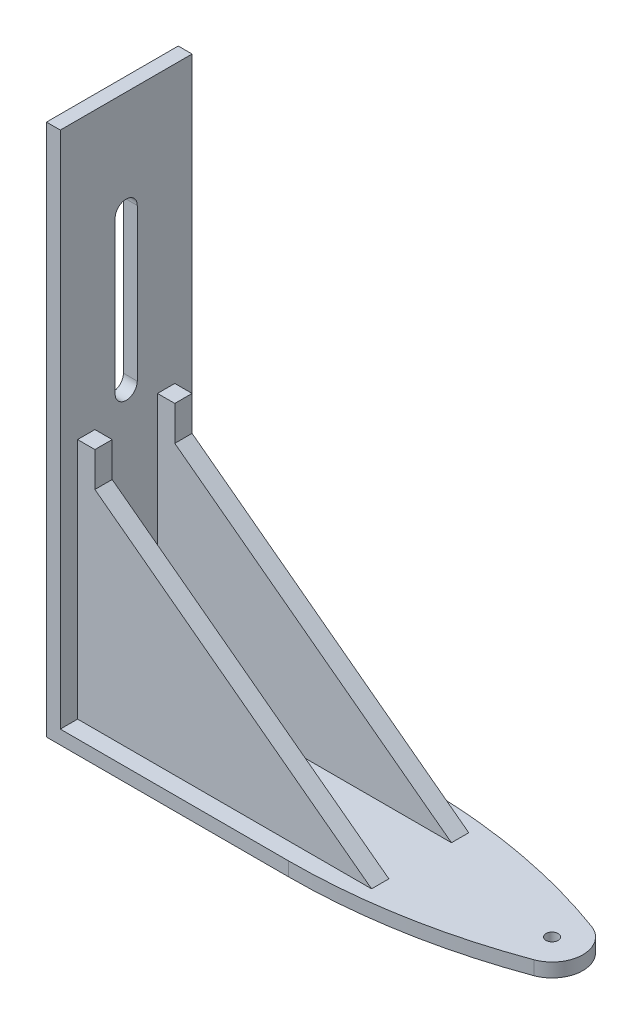
ISO-10303-21;
HEADER;
FILE_DESCRIPTION(('STEP AP214'),'2;1');
FILE_NAME('part.step','',(''),(''),'','','');
FILE_SCHEMA(('AUTOMOTIVE_DESIGN { 1 0 10303 214 1 1 1 1 }'));
ENDSEC;
DATA;
#1=APPLICATION_CONTEXT('core data for automotive mechanical design processes');
#2=APPLICATION_PROTOCOL_DEFINITION('international standard','automotive_design',2000,#1);
#3=PRODUCT_CONTEXT('',#1,'mechanical');
#4=PRODUCT('Part','Part','',(#3));
#5=PRODUCT_RELATED_PRODUCT_CATEGORY('part','',(#4));
#6=PRODUCT_DEFINITION_FORMATION('','',#4);
#7=PRODUCT_DEFINITION_CONTEXT('part definition',#1,'design');
#8=PRODUCT_DEFINITION('design','',#6,#7);
#9=PRODUCT_DEFINITION_SHAPE('','',#8);
#10=(LENGTH_UNIT() NAMED_UNIT(*) SI_UNIT(.MILLI.,.METRE.));
#11=(NAMED_UNIT(*) PLANE_ANGLE_UNIT() SI_UNIT($,.RADIAN.));
#12=(NAMED_UNIT(*) SI_UNIT($,.STERADIAN.) SOLID_ANGLE_UNIT());
#13=UNCERTAINTY_MEASURE_WITH_UNIT(LENGTH_MEASURE(1.E-05),#10,'distance_accuracy_value','');
#14=(GEOMETRIC_REPRESENTATION_CONTEXT(3) GLOBAL_UNCERTAINTY_ASSIGNED_CONTEXT((#13)) GLOBAL_UNIT_ASSIGNED_CONTEXT((#10,
#11,#12)) REPRESENTATION_CONTEXT('',''));
#15=CARTESIAN_POINT('',(0.,0.,0.));
#16=DIRECTION('',(0.,0.,1.));
#17=DIRECTION('',(1.,0.,0.));
#18=AXIS2_PLACEMENT_3D('',#15,#16,#17);
#19=CARTESIAN_POINT('',(28.575,0.,77.8271875000001));
#20=DIRECTION('',(0.,-1.,0.));
#21=DIRECTION('',(0.,0.,-1.));
#22=AXIS2_PLACEMENT_3D('',#19,#20,#21);
#23=PLANE('',#22);
#24=CARTESIAN_POINT('',(57.15,0.,0.));
#25=DIRECTION('',(0.,-1.,0.));
#26=DIRECTION('',(0.,0.,-1.));
#27=AXIS2_PLACEMENT_3D('',#24,#25,#26);
#28=CIRCLE('',#27,1.75);
#29=CARTESIAN_POINT('',(57.15,0.,-1.75));
#30=VERTEX_POINT('',#29);
#31=EDGE_CURVE('E11',#30,#30,#28,.T.);
#32=ORIENTED_EDGE('',*,*,#31,.T.);
#33=EDGE_LOOP('',(#32));
#34=FACE_BOUND('',#33,.T.);
#35=CARTESIAN_POINT('',(-57.15,0.,0.));
#36=DIRECTION('',(0.,-1.,0.));
#37=DIRECTION('',(0.,0.,-1.));
#38=AXIS2_PLACEMENT_3D('',#35,#36,#37);
#39=CIRCLE('',#38,1.75);
#40=CARTESIAN_POINT('',(-57.15,0.,-1.75));
#41=VERTEX_POINT('',#40);
#42=EDGE_CURVE('E346',#41,#41,#39,.T.);
#43=ORIENTED_EDGE('',*,*,#42,.T.);
#44=EDGE_LOOP('',(#43));
#45=FACE_BOUND('',#44,.T.);
#46=DIRECTION('',(0.,0.,-1.));
#47=VECTOR('',#46,1.);
#48=CARTESIAN_POINT('',(19.,0.,-9.04999999999998));
#49=LINE('',#48,#47);
#50=CARTESIAN_POINT('',(19.,0.,-9.04999999999999));
#51=VERTEX_POINT('',#50);
#52=CARTESIAN_POINT('',(19.,0.,-14.05));
#53=VERTEX_POINT('',#52);
#54=EDGE_CURVE('E233',#51,#53,#49,.T.);
#55=ORIENTED_EDGE('',*,*,#54,.F.);
#56=DIRECTION('',(-1.,0.,0.));
#57=VECTOR('',#56,1.);
#58=CARTESIAN_POINT('',(-61.,0.,-9.04999999999998));
#59=LINE('',#58,#57);
#60=CARTESIAN_POINT('',(-66.,0.,-9.04999999999998));
#61=VERTEX_POINT('',#60);
#62=EDGE_CURVE('E69',#51,#61,#59,.T.);
#63=ORIENTED_EDGE('',*,*,#62,.T.);
#64=DIRECTION('',(0.,0.,-1.));
#65=VECTOR('',#64,1.);
#66=CARTESIAN_POINT('',(-66.,0.,19.05));
#67=LINE('',#66,#65);
#68=CARTESIAN_POINT('',(-66.,0.,9.04999999999998));
#69=VERTEX_POINT('',#68);
#70=EDGE_CURVE('E339',#69,#61,#67,.T.);
#71=ORIENTED_EDGE('',*,*,#70,.F.);
#72=DIRECTION('',(-1.,0.,0.));
#73=VECTOR('',#72,1.);
#74=CARTESIAN_POINT('',(-61.,0.,9.04999999999998));
#75=LINE('',#74,#73);
#76=CARTESIAN_POINT('',(19.,0.,9.04999999999997));
#77=VERTEX_POINT('',#76);
#78=EDGE_CURVE('E287',#77,#69,#75,.T.);
#79=ORIENTED_EDGE('',*,*,#78,.F.);
#80=DIRECTION('',(0.,0.,-1.));
#81=VECTOR('',#80,1.);
#82=CARTESIAN_POINT('',(19.,0.,14.05));
#83=LINE('',#82,#81);
#84=CARTESIAN_POINT('',(19.,0.,14.05));
#85=VERTEX_POINT('',#84);
#86=EDGE_CURVE('E244',#85,#77,#83,.T.);
#87=ORIENTED_EDGE('',*,*,#86,.F.);
#88=DIRECTION('',(-1.,0.,0.));
#89=VECTOR('',#88,1.);
#90=CARTESIAN_POINT('',(-61.,0.,14.05));
#91=LINE('',#90,#89);
#92=CARTESIAN_POINT('',(-66.,0.,14.05));
#93=VERTEX_POINT('',#92);
#94=EDGE_CURVE('E290',#85,#93,#91,.T.);
#95=ORIENTED_EDGE('',*,*,#94,.T.);
#96=CARTESIAN_POINT('',(-66.,0.,19.05));
#97=VERTEX_POINT('',#96);
#98=EDGE_CURVE('E329',#97,#93,#67,.T.);
#99=ORIENTED_EDGE('',*,*,#98,.F.);
#100=DIRECTION('',(-1.,0.,0.));
#101=VECTOR('',#100,1.);
#102=CARTESIAN_POINT('',(-5.53887480243138E-13,0.,19.05));
#103=LINE('',#102,#101);
#104=CARTESIAN_POINT('',(-2.17783966390342E-10,0.,19.0500158225532));
#105=VERTEX_POINT('',#104);
#106=EDGE_CURVE('E372',#105,#97,#103,.T.);
#107=ORIENTED_EDGE('',*,*,#106,.F.);
#108=CARTESIAN_POINT('',(0.,0.,-155.654375));
#109=DIRECTION('',(0.,-1.,0.));
#110=DIRECTION('',(0.306016498986767,0.,0.952026208855556));
#111=AXIS2_PLACEMENT_3D('',#108,#109,#110);
#112=CIRCLE('',#111,174.704375);
#113=CARTESIAN_POINT('',(53.4624240856459,0.,10.6687778038663));
#114=VERTEX_POINT('',#113);
#115=EDGE_CURVE('E491',#114,#105,#112,.T.);
#116=ORIENTED_EDGE('',*,*,#115,.F.);
#117=CARTESIAN_POINT('',(53.4624211923201,0.,10.6687688026458));
#118=CARTESIAN_POINT('',(56.8619809477883,0.,9.57602433329544));
#119=CARTESIAN_POINT('',(60.2140497845846,0.,8.34528003829632));
#120=B_SPLINE_CURVE_WITH_KNOTS('',2,(#117,#118,#119),.UNSPECIFIED.,.F.,.F.,(3,3),(0.,1.),.UNSPECIFIED.);
#121=CARTESIAN_POINT('',(60.2140497845846,0.,8.34528003829629));
#122=VERTEX_POINT('',#121);
#123=EDGE_CURVE('E420',#114,#122,#120,.T.);
#124=ORIENTED_EDGE('',*,*,#123,.T.);
#125=CARTESIAN_POINT('',(57.15,0.,0.));
#126=DIRECTION('',(0.,-1.,0.));
#127=DIRECTION('',(1.,0.,2.24848490181083E-12));
#128=AXIS2_PLACEMENT_3D('',#125,#126,#127);
#129=CIRCLE('',#128,8.88999999999998);
#130=CARTESIAN_POINT('',(66.04,0.,-1.93426034874905E-07));
#131=VERTEX_POINT('',#130);
#132=EDGE_CURVE('E412',#131,#122,#129,.T.);
#133=ORIENTED_EDGE('',*,*,#132,.F.);
#134=CARTESIAN_POINT('',(57.15,0.,0.));
#135=DIRECTION('',(0.,-1.,0.));
#136=DIRECTION('',(0.34466251794942,0.,-0.938726663475991));
#137=AXIS2_PLACEMENT_3D('',#134,#135,#136);
#138=CIRCLE('',#137,8.88999999999999);
#139=CARTESIAN_POINT('',(60.2140497845703,0.,-8.34528003830157));
#140=VERTEX_POINT('',#139);
#141=EDGE_CURVE('E61',#140,#131,#138,.T.);
#142=ORIENTED_EDGE('',*,*,#141,.F.);
#143=CARTESIAN_POINT('',(60.2140497845703,0.,-8.34528003830154));
#144=CARTESIAN_POINT('',(52.9956261443582,0.,-10.9955936644878));
#145=CARTESIAN_POINT('',(45.5727926874733,0.,-13.0013074148099));
#146=CARTESIAN_POINT('',(38.1491633141901,0.,-15.0072362286213));
#147=CARTESIAN_POINT('',(30.5790893459733,0.,-16.3530025711716));
#148=CARTESIAN_POINT('',(23.0079323569814,0.,-17.6989614472314));
#149=CARTESIAN_POINT('',(15.3488965430712,0.,-18.3744445071458));
#150=CARTESIAN_POINT('',(7.68876498195084,0.,-19.0500242056836));
#151=CARTESIAN_POINT('',(-8.3544282603043E-12,0.,-19.05));
#152=CARTESIAN_POINT('',(-7.68986498421346,0.,-19.0499757908533));
#153=CARTESIAN_POINT('',(-15.3488965430879,0.,-18.3744445071443));
#154=CARTESIAN_POINT('',(-23.0090238504205,0.,-17.6988165777488));
#155=CARTESIAN_POINT('',(-30.5790893459898,0.,-16.3530025711687));
#156=CARTESIAN_POINT('',(-38.1502378606533,0.,-15.0069960243434));
#157=CARTESIAN_POINT('',(-45.5727926874894,0.,-13.0013074148055));
#158=CARTESIAN_POINT('',(-52.9961434454346,0.,-10.9954037324258));
#159=CARTESIAN_POINT('',(-60.2140497845859,0.,-8.34528003829582));
#160=B_SPLINE_CURVE_WITH_KNOTS('',2,(#143,#144,#145,#146,#147,#148,#149,#150,#151,#152,#153,
#154,#155,#156,#157,#158,#159),.UNSPECIFIED.,.F.,.F.,(3,2,2,2,2,2,2,2,3),(0.,0.125,0.25,0.375,
0.5,0.625,0.75,0.875,1.),.UNSPECIFIED.);
#161=CARTESIAN_POINT('',(0.000275475151780874,0.,-19.0500000002166));
#162=VERTEX_POINT('',#161);
#163=EDGE_CURVE('E400',#140,#162,#160,.T.);
#164=ORIENTED_EDGE('',*,*,#163,.T.);
#165=DIRECTION('',(-1.,0.,0.));
#166=VECTOR('',#165,1.);
#167=CARTESIAN_POINT('',(-5.53887480243138E-13,0.,-19.05));
#168=LINE('',#167,#166);
#169=CARTESIAN_POINT('',(-66.,0.,-19.0500000002166));
#170=VERTEX_POINT('',#169);
#171=EDGE_CURVE('E360',#162,#170,#168,.T.);
#172=ORIENTED_EDGE('',*,*,#171,.T.);
#173=CARTESIAN_POINT('',(-66.,0.,-14.05));
#174=VERTEX_POINT('',#173);
#175=EDGE_CURVE('E318',#174,#170,#67,.T.);
#176=ORIENTED_EDGE('',*,*,#175,.F.);
#177=DIRECTION('',(-1.,0.,0.));
#178=VECTOR('',#177,1.);
#179=CARTESIAN_POINT('',(-61.,0.,-14.05));
#180=LINE('',#179,#178);
#181=EDGE_CURVE('E76',#53,#174,#180,.T.);
#182=ORIENTED_EDGE('',*,*,#181,.F.);
#183=EDGE_LOOP('',(#55,#63,#71,#79,#87,#95,#99,#107,#116,#124,#133,#142,#164,#172,#176,#182));
#184=FACE_BOUND('',#183,.T.);
#185=ADVANCED_FACE('F48',(#34,#45,#184),#23,.F.);
#186=CARTESIAN_POINT('',(-66.,150.,19.05));
#187=DIRECTION('',(-1.,0.,0.));
#188=DIRECTION('',(0.,0.,1.));
#189=AXIS2_PLACEMENT_3D('',#186,#187,#188);
#190=PLANE('',#189);
#191=DIRECTION('',(0.,1.,0.));
#192=VECTOR('',#191,1.);
#193=CARTESIAN_POINT('',(-66.,76.,3.20000000000001));
#194=LINE('',#193,#192);
#195=CARTESIAN_POINT('',(-66.,76.,3.20000000000001));
#196=VERTEX_POINT('',#195);
#197=CARTESIAN_POINT('',(-66.,120.,3.2));
#198=VERTEX_POINT('',#197);
#199=EDGE_CURVE('E303',#196,#198,#194,.T.);
#200=ORIENTED_EDGE('',*,*,#199,.T.);
#201=CARTESIAN_POINT('',(-66.,120.,0.));
#202=DIRECTION('',(-1.,0.,0.));
#203=DIRECTION('',(0.,0.,1.));
#204=AXIS2_PLACEMENT_3D('',#201,#202,#203);
#205=CIRCLE('',#204,3.2);
#206=CARTESIAN_POINT('',(-66.,120.,-3.2));
#207=VERTEX_POINT('',#206);
#208=EDGE_CURVE('E293',#198,#207,#205,.T.);
#209=ORIENTED_EDGE('',*,*,#208,.T.);
#210=DIRECTION('',(0.,-1.,0.));
#211=VECTOR('',#210,1.);
#212=CARTESIAN_POINT('',(-66.,120.,-3.2));
#213=LINE('',#212,#211);
#214=CARTESIAN_POINT('',(-66.,76.,-3.19999999999999));
#215=VERTEX_POINT('',#214);
#216=EDGE_CURVE('E296',#207,#215,#213,.T.);
#217=ORIENTED_EDGE('',*,*,#216,.T.);
#218=CARTESIAN_POINT('',(-66.,76.,0.));
#219=DIRECTION('',(-1.,0.,0.));
#220=DIRECTION('',(0.,0.,1.));
#221=AXIS2_PLACEMENT_3D('',#218,#219,#220);
#222=CIRCLE('',#221,3.2);
#223=EDGE_CURVE('E300',#215,#196,#222,.T.);
#224=ORIENTED_EDGE('',*,*,#223,.T.);
#225=EDGE_LOOP('',(#200,#209,#217,#224));
#226=FACE_BOUND('',#225,.T.);
#227=DIRECTION('',(0.,1.,0.));
#228=VECTOR('',#227,1.);
#229=CARTESIAN_POINT('',(-66.,0.,-14.05));
#230=LINE('',#229,#228);
#231=CARTESIAN_POINT('',(-66.,70.,-14.05));
#232=VERTEX_POINT('',#231);
#233=EDGE_CURVE('E250',#174,#232,#230,.T.);
#234=ORIENTED_EDGE('',*,*,#233,.F.);
#235=ORIENTED_EDGE('',*,*,#175,.T.);
#236=DIRECTION('',(0.,-1.,0.));
#237=VECTOR('',#236,1.);
#238=CARTESIAN_POINT('',(-66.,150.,-19.0500000002166));
#239=LINE('',#238,#237);
#240=CARTESIAN_POINT('',(-66.,150.,-19.0500000002166));
#241=VERTEX_POINT('',#240);
#242=EDGE_CURVE('E336',#241,#170,#239,.T.);
#243=ORIENTED_EDGE('',*,*,#242,.F.);
#244=DIRECTION('',(0.,0.,-1.));
#245=VECTOR('',#244,1.);
#246=CARTESIAN_POINT('',(-66.,150.,19.05));
#247=LINE('',#246,#245);
#248=CARTESIAN_POINT('',(-66.,150.,19.05));
#249=VERTEX_POINT('',#248);
#250=EDGE_CURVE('E328',#249,#241,#247,.T.);
#251=ORIENTED_EDGE('',*,*,#250,.F.);
#252=DIRECTION('',(0.,-1.,0.));
#253=VECTOR('',#252,1.);
#254=CARTESIAN_POINT('',(-66.,150.,19.05));
#255=LINE('',#254,#253);
#256=EDGE_CURVE('E340',#249,#97,#255,.T.);
#257=ORIENTED_EDGE('',*,*,#256,.T.);
#258=ORIENTED_EDGE('',*,*,#98,.T.);
#259=DIRECTION('',(0.,-1.,0.));
#260=VECTOR('',#259,1.);
#261=CARTESIAN_POINT('',(-66.,0.,14.05));
#262=LINE('',#261,#260);
#263=CARTESIAN_POINT('',(-66.,70.,14.05));
#264=VERTEX_POINT('',#263);
#265=EDGE_CURVE('E266',#264,#93,#262,.T.);
#266=ORIENTED_EDGE('',*,*,#265,.F.);
#267=DIRECTION('',(0.,0.,1.));
#268=VECTOR('',#267,1.);
#269=CARTESIAN_POINT('',(-66.,70.,14.05));
#270=LINE('',#269,#268);
#271=CARTESIAN_POINT('',(-66.,70.,9.04999999999998));
#272=VERTEX_POINT('',#271);
#273=EDGE_CURVE('E270',#272,#264,#270,.T.);
#274=ORIENTED_EDGE('',*,*,#273,.F.);
#275=DIRECTION('',(0.,1.,0.));
#276=VECTOR('',#275,1.);
#277=CARTESIAN_POINT('',(-66.,0.,9.04999999999998));
#278=LINE('',#277,#276);
#279=EDGE_CURVE('E277',#69,#272,#278,.T.);
#280=ORIENTED_EDGE('',*,*,#279,.F.);
#281=ORIENTED_EDGE('',*,*,#70,.T.);
#282=DIRECTION('',(0.,-1.,0.));
#283=VECTOR('',#282,1.);
#284=CARTESIAN_POINT('',(-66.,0.,-9.04999999999998));
#285=LINE('',#284,#283);
#286=CARTESIAN_POINT('',(-66.,70.,-9.04999999999998));
#287=VERTEX_POINT('',#286);
#288=EDGE_CURVE('E223',#287,#61,#285,.T.);
#289=ORIENTED_EDGE('',*,*,#288,.F.);
#290=DIRECTION('',(0.,0.,1.));
#291=VECTOR('',#290,1.);
#292=CARTESIAN_POINT('',(-66.,70.,-14.05));
#293=LINE('',#292,#291);
#294=EDGE_CURVE('E256',#232,#287,#293,.T.);
#295=ORIENTED_EDGE('',*,*,#294,.F.);
#296=EDGE_LOOP('',(#234,#235,#243,#251,#257,#258,#266,#274,#280,#281,#289,#295));
#297=FACE_BOUND('',#296,.T.);
#298=ADVANCED_FACE('F531',(#226,#297),#190,.F.);
#299=CARTESIAN_POINT('',(0.,-4.,155.654375));
#300=DIRECTION('',(0.,1.,0.));
#301=DIRECTION('',(0.,0.,1.));
#302=AXIS2_PLACEMENT_3D('',#299,#300,#301);
#303=CYLINDRICAL_SURFACE('',#302,174.704375);
#304=DIRECTION('',(0.,-1.,0.));
#305=VECTOR('',#304,1.);
#306=CARTESIAN_POINT('',(-5.53887480243138E-13,0.,-19.05));
#307=LINE('',#306,#305);
#308=CARTESIAN_POINT('',(-5.53887480243138E-13,-4.,-19.05));
#309=VERTEX_POINT('',#308);
#310=EDGE_CURVE('E369',#162,#309,#307,.T.);
#311=ORIENTED_EDGE('',*,*,#310,.F.);
#312=ORIENTED_EDGE('',*,*,#163,.F.);
#313=DIRECTION('',(0.,1.,0.));
#314=VECTOR('',#313,1.);
#315=CARTESIAN_POINT('',(60.2140497845703,-4.,-8.34528003830157));
#316=LINE('',#315,#314);
#317=CARTESIAN_POINT('',(60.2140497845703,-4.,-8.34528003830157));
#318=VERTEX_POINT('',#317);
#319=EDGE_CURVE('E404',#318,#140,#316,.T.);
#320=ORIENTED_EDGE('',*,*,#319,.F.);
#321=CARTESIAN_POINT('',(0.,-4.,155.654375));
#322=DIRECTION('',(0.,-1.,0.));
#323=DIRECTION('',(0.,0.,-1.));
#324=AXIS2_PLACEMENT_3D('',#321,#322,#323);
#325=CIRCLE('',#324,174.704375);
#326=EDGE_CURVE('E386',#309,#318,#325,.T.);
#327=ORIENTED_EDGE('',*,*,#326,.F.);
#328=EDGE_LOOP('',(#311,#312,#320,#327));
#329=FACE_BOUND('',#328,.T.);
#330=ADVANCED_FACE('F50',(#329),#303,.T.);
#331=CARTESIAN_POINT('',(0.,-4.,-155.654375));
#332=DIRECTION('',(0.,1.,0.));
#333=DIRECTION('',(0.,0.,1.));
#334=AXIS2_PLACEMENT_3D('',#331,#332,#333);
#335=CYLINDRICAL_SURFACE('',#334,174.704375);
#336=DIRECTION('',(0.,-1.,0.));
#337=VECTOR('',#336,1.);
#338=CARTESIAN_POINT('',(-5.53887480243138E-13,0.,19.05));
#339=LINE('',#338,#337);
#340=CARTESIAN_POINT('',(-5.53887480243138E-13,-4.,19.05));
#341=VERTEX_POINT('',#340);
#342=EDGE_CURVE('E364',#105,#341,#339,.T.);
#343=ORIENTED_EDGE('',*,*,#342,.T.);
#344=CARTESIAN_POINT('',(0.,-4.,-155.654375));
#345=DIRECTION('',(0.,-1.,0.));
#346=DIRECTION('',(0.,0.,-1.));
#347=AXIS2_PLACEMENT_3D('',#344,#345,#346);
#348=CIRCLE('',#347,174.704375);
#349=CARTESIAN_POINT('',(60.2140497845846,-4.,8.34528003829629));
#350=VERTEX_POINT('',#349);
#351=EDGE_CURVE('E390',#350,#341,#348,.T.);
#352=ORIENTED_EDGE('',*,*,#351,.F.);
#353=DIRECTION('',(0.,1.,0.));
#354=VECTOR('',#353,1.);
#355=CARTESIAN_POINT('',(60.2140497845846,-4.,8.34528003829629));
#356=LINE('',#355,#354);
#357=EDGE_CURVE('E393',#350,#122,#356,.T.);
#358=ORIENTED_EDGE('',*,*,#357,.T.);
#359=ORIENTED_EDGE('',*,*,#123,.F.);
#360=ORIENTED_EDGE('',*,*,#115,.T.);
#361=EDGE_LOOP('',(#343,#352,#358,#359,#360));
#362=FACE_BOUND('',#361,.T.);
#363=ADVANCED_FACE('F426',(#362),#335,.T.);
#364=CARTESIAN_POINT('',(57.15,-4.,0.));
#365=DIRECTION('',(0.,1.,0.));
#366=DIRECTION('',(0.,0.,1.));
#367=AXIS2_PLACEMENT_3D('',#364,#365,#366);
#368=CYLINDRICAL_SURFACE('',#367,8.88999999999999);
#369=ORIENTED_EDGE('',*,*,#141,.T.);
#370=ORIENTED_EDGE('',*,*,#132,.T.);
#371=ORIENTED_EDGE('',*,*,#357,.F.);
#372=CARTESIAN_POINT('',(57.15,-4.,0.));
#373=DIRECTION('',(0.,-1.,0.));
#374=DIRECTION('',(0.,0.,-1.));
#375=AXIS2_PLACEMENT_3D('',#372,#373,#374);
#376=CIRCLE('',#375,8.88999999999999);
#377=EDGE_CURVE('E388',#318,#350,#376,.T.);
#378=ORIENTED_EDGE('',*,*,#377,.F.);
#379=ORIENTED_EDGE('',*,*,#319,.T.);
#380=EDGE_LOOP('',(#369,#370,#371,#378,#379));
#381=FACE_BOUND('',#380,.T.);
#382=ADVANCED_FACE('F434',(#381),#368,.T.);
#383=CARTESIAN_POINT('',(28.575,-4.,77.8271875000001));
#384=DIRECTION('',(0.,-1.,0.));
#385=DIRECTION('',(0.,0.,-1.));
#386=AXIS2_PLACEMENT_3D('',#383,#384,#385);
#387=PLANE('',#386);
#388=CARTESIAN_POINT('',(-57.15,-4.,0.));
#389=DIRECTION('',(0.,-1.,0.));
#390=DIRECTION('',(0.,0.,-1.));
#391=AXIS2_PLACEMENT_3D('',#388,#389,#390);
#392=CIRCLE('',#391,1.75);
#393=CARTESIAN_POINT('',(-57.15,-4.,-1.75));
#394=VERTEX_POINT('',#393);
#395=EDGE_CURVE('E343',#394,#394,#392,.T.);
#396=ORIENTED_EDGE('',*,*,#395,.F.);
#397=EDGE_LOOP('',(#396));
#398=FACE_BOUND('',#397,.T.);
#399=DIRECTION('',(-1.,0.,0.));
#400=VECTOR('',#399,1.);
#401=CARTESIAN_POINT('',(-5.53887480243138E-13,-4.,-19.05));
#402=LINE('',#401,#400);
#403=CARTESIAN_POINT('',(-70.,-4.,-19.05));
#404=VERTEX_POINT('',#403);
#405=EDGE_CURVE('E349',#309,#404,#402,.T.);
#406=ORIENTED_EDGE('',*,*,#405,.F.);
#407=ORIENTED_EDGE('',*,*,#326,.T.);
#408=ORIENTED_EDGE('',*,*,#377,.T.);
#409=ORIENTED_EDGE('',*,*,#351,.T.);
#410=DIRECTION('',(-1.,0.,0.));
#411=VECTOR('',#410,1.);
#412=CARTESIAN_POINT('',(-5.53887480243138E-13,-4.,19.05));
#413=LINE('',#412,#411);
#414=CARTESIAN_POINT('',(-70.,-4.,19.05));
#415=VERTEX_POINT('',#414);
#416=EDGE_CURVE('E357',#341,#415,#413,.T.);
#417=ORIENTED_EDGE('',*,*,#416,.T.);
#418=DIRECTION('',(0.,0.,-1.));
#419=VECTOR('',#418,1.);
#420=CARTESIAN_POINT('',(-70.,-4.,19.05));
#421=LINE('',#420,#419);
#422=EDGE_CURVE('E354',#415,#404,#421,.T.);
#423=ORIENTED_EDGE('',*,*,#422,.T.);
#424=EDGE_LOOP('',(#406,#407,#408,#409,#417,#423));
#425=FACE_BOUND('',#424,.T.);
#426=CARTESIAN_POINT('',(57.15,-4.,0.));
#427=DIRECTION('',(0.,-1.,0.));
#428=DIRECTION('',(0.,0.,-1.));
#429=AXIS2_PLACEMENT_3D('',#426,#427,#428);
#430=CIRCLE('',#429,1.75);
#431=CARTESIAN_POINT('',(57.15,-4.,-1.75));
#432=VERTEX_POINT('',#431);
#433=EDGE_CURVE('E366',#432,#432,#430,.T.);
#434=ORIENTED_EDGE('',*,*,#433,.F.);
#435=EDGE_LOOP('',(#434));
#436=FACE_BOUND('',#435,.T.);
#437=ADVANCED_FACE('F520',(#398,#425,#436),#387,.T.);
#438=CARTESIAN_POINT('',(57.15,-4.,0.));
#439=DIRECTION('',(0.,1.,0.));
#440=DIRECTION('',(0.,0.,1.));
#441=AXIS2_PLACEMENT_3D('',#438,#439,#440);
#442=CYLINDRICAL_SURFACE('',#441,1.75);
#443=ORIENTED_EDGE('',*,*,#433,.T.);
#444=EDGE_LOOP('',(#443));
#445=FACE_BOUND('',#444,.T.);
#446=ORIENTED_EDGE('',*,*,#31,.F.);
#447=EDGE_LOOP('',(#446));
#448=FACE_BOUND('',#447,.T.);
#449=ADVANCED_FACE('F528',(#445,#448),#442,.F.);
#450=CARTESIAN_POINT('',(-5.53887480243138E-13,0.,-19.05));
#451=DIRECTION('',(0.,0.,1.));
#452=DIRECTION('',(1.,0.,0.));
#453=AXIS2_PLACEMENT_3D('',#450,#451,#452);
#454=PLANE('',#453);
#455=ORIENTED_EDGE('',*,*,#405,.T.);
#456=DIRECTION('',(0.,-1.,0.));
#457=VECTOR('',#456,1.);
#458=CARTESIAN_POINT('',(-70.,0.,-19.05));
#459=LINE('',#458,#457);
#460=CARTESIAN_POINT('',(-70.,150.,-19.0500000002166));
#461=VERTEX_POINT('',#460);
#462=EDGE_CURVE('E363',#461,#404,#459,.T.);
#463=ORIENTED_EDGE('',*,*,#462,.F.);
#464=DIRECTION('',(1.,0.,0.));
#465=VECTOR('',#464,1.);
#466=CARTESIAN_POINT('',(-70.,150.,-19.0500000002166));
#467=LINE('',#466,#465);
#468=EDGE_CURVE('E325',#461,#241,#467,.T.);
#469=ORIENTED_EDGE('',*,*,#468,.T.);
#470=ORIENTED_EDGE('',*,*,#242,.T.);
#471=ORIENTED_EDGE('',*,*,#171,.F.);
#472=ORIENTED_EDGE('',*,*,#310,.T.);
#473=EDGE_LOOP('',(#455,#463,#469,#470,#471,#472));
#474=FACE_BOUND('',#473,.T.);
#475=ADVANCED_FACE('F561',(#474),#454,.F.);
#476=CARTESIAN_POINT('',(-70.,0.,19.05));
#477=DIRECTION('',(-1.,0.,0.));
#478=DIRECTION('',(0.,0.,1.));
#479=AXIS2_PLACEMENT_3D('',#476,#477,#478);
#480=PLANE('',#479);
#481=CARTESIAN_POINT('',(-70.,120.,0.));
#482=DIRECTION('',(-1.,0.,0.));
#483=DIRECTION('',(0.,0.,1.));
#484=AXIS2_PLACEMENT_3D('',#481,#482,#483);
#485=CIRCLE('',#484,3.2);
#486=CARTESIAN_POINT('',(-70.,120.,3.2));
#487=VERTEX_POINT('',#486);
#488=CARTESIAN_POINT('',(-70.,120.,-3.2));
#489=VERTEX_POINT('',#488);
#490=EDGE_CURVE('E292',#487,#489,#485,.T.);
#491=ORIENTED_EDGE('',*,*,#490,.F.);
#492=DIRECTION('',(0.,1.,0.));
#493=VECTOR('',#492,1.);
#494=CARTESIAN_POINT('',(-70.,76.,3.20000000000001));
#495=LINE('',#494,#493);
#496=CARTESIAN_POINT('',(-70.,76.,3.20000000000001));
#497=VERTEX_POINT('',#496);
#498=EDGE_CURVE('E297',#497,#487,#495,.T.);
#499=ORIENTED_EDGE('',*,*,#498,.F.);
#500=CARTESIAN_POINT('',(-70.,76.,0.));
#501=DIRECTION('',(-1.,0.,0.));
#502=DIRECTION('',(0.,0.,1.));
#503=AXIS2_PLACEMENT_3D('',#500,#501,#502);
#504=CIRCLE('',#503,3.2);
#505=CARTESIAN_POINT('',(-70.,76.,-3.19999999999999));
#506=VERTEX_POINT('',#505);
#507=EDGE_CURVE('E311',#506,#497,#504,.T.);
#508=ORIENTED_EDGE('',*,*,#507,.F.);
#509=DIRECTION('',(0.,-1.,0.));
#510=VECTOR('',#509,1.);
#511=CARTESIAN_POINT('',(-70.,120.,-3.2));
#512=LINE('',#511,#510);
#513=EDGE_CURVE('E308',#489,#506,#512,.T.);
#514=ORIENTED_EDGE('',*,*,#513,.F.);
#515=EDGE_LOOP('',(#491,#499,#508,#514));
#516=FACE_BOUND('',#515,.T.);
#517=ORIENTED_EDGE('',*,*,#422,.F.);
#518=DIRECTION('',(0.,-1.,0.));
#519=VECTOR('',#518,1.);
#520=CARTESIAN_POINT('',(-70.,0.,19.05));
#521=LINE('',#520,#519);
#522=CARTESIAN_POINT('',(-70.,150.,19.05));
#523=VERTEX_POINT('',#522);
#524=EDGE_CURVE('E361',#523,#415,#521,.T.);
#525=ORIENTED_EDGE('',*,*,#524,.F.);
#526=DIRECTION('',(0.,0.,-1.));
#527=VECTOR('',#526,1.);
#528=CARTESIAN_POINT('',(-70.,150.,19.05));
#529=LINE('',#528,#527);
#530=EDGE_CURVE('E333',#523,#461,#529,.T.);
#531=ORIENTED_EDGE('',*,*,#530,.T.);
#532=ORIENTED_EDGE('',*,*,#462,.T.);
#533=EDGE_LOOP('',(#517,#525,#531,#532));
#534=FACE_BOUND('',#533,.T.);
#535=ADVANCED_FACE('F556',(#516,#534),#480,.T.);
#536=CARTESIAN_POINT('',(-5.53887480243138E-13,0.,19.05));
#537=DIRECTION('',(0.,0.,1.));
#538=DIRECTION('',(1.,0.,0.));
#539=AXIS2_PLACEMENT_3D('',#536,#537,#538);
#540=PLANE('',#539);
#541=ORIENTED_EDGE('',*,*,#416,.F.);
#542=ORIENTED_EDGE('',*,*,#342,.F.);
#543=ORIENTED_EDGE('',*,*,#106,.T.);
#544=ORIENTED_EDGE('',*,*,#256,.F.);
#545=DIRECTION('',(1.,0.,0.));
#546=VECTOR('',#545,1.);
#547=CARTESIAN_POINT('',(-70.,150.,19.05));
#548=LINE('',#547,#546);
#549=EDGE_CURVE('E331',#523,#249,#548,.T.);
#550=ORIENTED_EDGE('',*,*,#549,.F.);
#551=ORIENTED_EDGE('',*,*,#524,.T.);
#552=EDGE_LOOP('',(#541,#542,#543,#544,#550,#551));
#553=FACE_BOUND('',#552,.T.);
#554=ADVANCED_FACE('F546',(#553),#540,.T.);
#555=CARTESIAN_POINT('',(-57.15,0.,0.));
#556=DIRECTION('',(0.,-1.,0.));
#557=DIRECTION('',(0.,0.,-1.));
#558=AXIS2_PLACEMENT_3D('',#555,#556,#557);
#559=CYLINDRICAL_SURFACE('',#558,1.75);
#560=ORIENTED_EDGE('',*,*,#42,.F.);
#561=EDGE_LOOP('',(#560));
#562=FACE_BOUND('',#561,.T.);
#563=ORIENTED_EDGE('',*,*,#395,.T.);
#564=EDGE_LOOP('',(#563));
#565=FACE_BOUND('',#564,.T.);
#566=ADVANCED_FACE('F542',(#562,#565),#559,.F.);
#567=CARTESIAN_POINT('',(0.,150.,0.));
#568=DIRECTION('',(0.,1.,0.));
#569=DIRECTION('',(0.,0.,1.));
#570=AXIS2_PLACEMENT_3D('',#567,#568,#569);
#571=PLANE('',#570);
#572=ORIENTED_EDGE('',*,*,#468,.F.);
#573=ORIENTED_EDGE('',*,*,#530,.F.);
#574=ORIENTED_EDGE('',*,*,#549,.T.);
#575=ORIENTED_EDGE('',*,*,#250,.T.);
#576=EDGE_LOOP('',(#572,#573,#574,#575));
#577=FACE_BOUND('',#576,.T.);
#578=ADVANCED_FACE('F545',(#577),#571,.T.);
#579=CARTESIAN_POINT('',(-66.,120.,0.));
#580=DIRECTION('',(-1.,0.,0.));
#581=DIRECTION('',(0.,0.,1.));
#582=AXIS2_PLACEMENT_3D('',#579,#580,#581);
#583=CYLINDRICAL_SURFACE('',#582,3.2);
#584=ORIENTED_EDGE('',*,*,#490,.T.);
#585=DIRECTION('',(-1.,0.,0.));
#586=VECTOR('',#585,1.);
#587=CARTESIAN_POINT('',(-66.,120.,-3.2));
#588=LINE('',#587,#586);
#589=EDGE_CURVE('E306',#207,#489,#588,.T.);
#590=ORIENTED_EDGE('',*,*,#589,.F.);
#591=ORIENTED_EDGE('',*,*,#208,.F.);
#592=DIRECTION('',(-1.,0.,0.));
#593=VECTOR('',#592,1.);
#594=CARTESIAN_POINT('',(-66.,120.,3.2));
#595=LINE('',#594,#593);
#596=EDGE_CURVE('E316',#198,#487,#595,.T.);
#597=ORIENTED_EDGE('',*,*,#596,.T.);
#598=EDGE_LOOP('',(#584,#590,#591,#597));
#599=FACE_BOUND('',#598,.T.);
#600=ADVANCED_FACE('F553',(#599),#583,.F.);
#601=CARTESIAN_POINT('',(-66.,76.,3.20000000000001));
#602=DIRECTION('',(0.,0.,1.));
#603=DIRECTION('',(0.,-1.,0.));
#604=AXIS2_PLACEMENT_3D('',#601,#602,#603);
#605=PLANE('',#604);
#606=ORIENTED_EDGE('',*,*,#498,.T.);
#607=ORIENTED_EDGE('',*,*,#596,.F.);
#608=ORIENTED_EDGE('',*,*,#199,.F.);
#609=DIRECTION('',(-1.,0.,0.));
#610=VECTOR('',#609,1.);
#611=CARTESIAN_POINT('',(-66.,76.,3.20000000000001));
#612=LINE('',#611,#610);
#613=EDGE_CURVE('E319',#196,#497,#612,.T.);
#614=ORIENTED_EDGE('',*,*,#613,.T.);
#615=EDGE_LOOP('',(#606,#607,#608,#614));
#616=FACE_BOUND('',#615,.T.);
#617=ADVANCED_FACE('F603',(#616),#605,.F.);
#618=CARTESIAN_POINT('',(-66.,76.,0.));
#619=DIRECTION('',(-1.,0.,0.));
#620=DIRECTION('',(0.,0.,1.));
#621=AXIS2_PLACEMENT_3D('',#618,#619,#620);
#622=CYLINDRICAL_SURFACE('',#621,3.2);
#623=ORIENTED_EDGE('',*,*,#507,.T.);
#624=ORIENTED_EDGE('',*,*,#613,.F.);
#625=ORIENTED_EDGE('',*,*,#223,.F.);
#626=DIRECTION('',(-1.,0.,0.));
#627=VECTOR('',#626,1.);
#628=CARTESIAN_POINT('',(-66.,76.,-3.19999999999999));
#629=LINE('',#628,#627);
#630=EDGE_CURVE('E321',#215,#506,#629,.T.);
#631=ORIENTED_EDGE('',*,*,#630,.T.);
#632=EDGE_LOOP('',(#623,#624,#625,#631));
#633=FACE_BOUND('',#632,.T.);
#634=ADVANCED_FACE('F610',(#633),#622,.F.);
#635=CARTESIAN_POINT('',(-66.,120.,-3.2));
#636=DIRECTION('',(0.,0.,-1.));
#637=DIRECTION('',(0.,1.,0.));
#638=AXIS2_PLACEMENT_3D('',#635,#636,#637);
#639=PLANE('',#638);
#640=ORIENTED_EDGE('',*,*,#513,.T.);
#641=ORIENTED_EDGE('',*,*,#630,.F.);
#642=ORIENTED_EDGE('',*,*,#216,.F.);
#643=ORIENTED_EDGE('',*,*,#589,.T.);
#644=EDGE_LOOP('',(#640,#641,#642,#643));
#645=FACE_BOUND('',#644,.T.);
#646=ADVANCED_FACE('F618',(#645),#639,.F.);
#647=CARTESIAN_POINT('',(-61.,0.,14.05));
#648=DIRECTION('',(0.,0.,-1.));
#649=DIRECTION('',(-1.,0.,0.));
#650=AXIS2_PLACEMENT_3D('',#647,#648,#649);
#651=PLANE('',#650);
#652=ORIENTED_EDGE('',*,*,#265,.T.);
#653=ORIENTED_EDGE('',*,*,#94,.F.);
#654=DIRECTION('',(0.8,-0.6,0.));
#655=VECTOR('',#654,1.);
#656=CARTESIAN_POINT('',(19.,0.,14.05));
#657=LINE('',#656,#655);
#658=CARTESIAN_POINT('',(-61.,60.,14.05));
#659=VERTEX_POINT('',#658);
#660=EDGE_CURVE('E241',#659,#85,#657,.T.);
#661=ORIENTED_EDGE('',*,*,#660,.F.);
#662=DIRECTION('',(0.,-1.,0.));
#663=VECTOR('',#662,1.);
#664=CARTESIAN_POINT('',(-61.,0.,14.05));
#665=LINE('',#664,#663);
#666=CARTESIAN_POINT('',(-61.,70.,14.05));
#667=VERTEX_POINT('',#666);
#668=EDGE_CURVE('E267',#667,#659,#665,.T.);
#669=ORIENTED_EDGE('',*,*,#668,.F.);
#670=DIRECTION('',(-1.,0.,0.));
#671=VECTOR('',#670,1.);
#672=CARTESIAN_POINT('',(-61.,70.,14.05));
#673=LINE('',#672,#671);
#674=EDGE_CURVE('E274',#667,#264,#673,.T.);
#675=ORIENTED_EDGE('',*,*,#674,.T.);
#676=EDGE_LOOP('',(#652,#653,#661,#669,#675));
#677=FACE_BOUND('',#676,.T.);
#678=ADVANCED_FACE('F626',(#677),#651,.F.);
#679=CARTESIAN_POINT('',(-61.,0.,9.04999999999998));
#680=DIRECTION('',(0.,0.,1.));
#681=DIRECTION('',(1.,0.,0.));
#682=AXIS2_PLACEMENT_3D('',#679,#680,#681);
#683=PLANE('',#682);
#684=ORIENTED_EDGE('',*,*,#279,.T.);
#685=DIRECTION('',(-1.,0.,0.));
#686=VECTOR('',#685,1.);
#687=CARTESIAN_POINT('',(-61.,70.,9.04999999999998));
#688=LINE('',#687,#686);
#689=CARTESIAN_POINT('',(-61.,70.,9.04999999999998));
#690=VERTEX_POINT('',#689);
#691=EDGE_CURVE('E284',#690,#272,#688,.T.);
#692=ORIENTED_EDGE('',*,*,#691,.F.);
#693=DIRECTION('',(0.,1.,0.));
#694=VECTOR('',#693,1.);
#695=CARTESIAN_POINT('',(-61.,0.,9.04999999999998));
#696=LINE('',#695,#694);
#697=CARTESIAN_POINT('',(-61.,60.,9.04999999999998));
#698=VERTEX_POINT('',#697);
#699=EDGE_CURVE('E269',#698,#690,#696,.T.);
#700=ORIENTED_EDGE('',*,*,#699,.F.);
#701=DIRECTION('',(0.8,-0.6,0.));
#702=VECTOR('',#701,1.);
#703=CARTESIAN_POINT('',(19.,0.,9.04999999999998));
#704=LINE('',#703,#702);
#705=EDGE_CURVE('E232',#698,#77,#704,.T.);
#706=ORIENTED_EDGE('',*,*,#705,.T.);
#707=ORIENTED_EDGE('',*,*,#78,.T.);
#708=EDGE_LOOP('',(#684,#692,#700,#706,#707));
#709=FACE_BOUND('',#708,.T.);
#710=ADVANCED_FACE('F635',(#709),#683,.F.);
#711=CARTESIAN_POINT('',(-61.,70.,14.05));
#712=DIRECTION('',(0.,-1.,0.));
#713=DIRECTION('',(0.,0.,-1.));
#714=AXIS2_PLACEMENT_3D('',#711,#712,#713);
#715=PLANE('',#714);
#716=ORIENTED_EDGE('',*,*,#273,.T.);
#717=ORIENTED_EDGE('',*,*,#674,.F.);
#718=DIRECTION('',(0.,0.,1.));
#719=VECTOR('',#718,1.);
#720=CARTESIAN_POINT('',(-61.,70.,14.05));
#721=LINE('',#720,#719);
#722=EDGE_CURVE('E272',#690,#667,#721,.T.);
#723=ORIENTED_EDGE('',*,*,#722,.F.);
#724=ORIENTED_EDGE('',*,*,#691,.T.);
#725=EDGE_LOOP('',(#716,#717,#723,#724));
#726=FACE_BOUND('',#725,.T.);
#727=ADVANCED_FACE('F644',(#726),#715,.F.);
#728=CARTESIAN_POINT('',(-61.,0.,0.));
#729=DIRECTION('',(-1.,0.,0.));
#730=DIRECTION('',(0.,0.,1.));
#731=AXIS2_PLACEMENT_3D('',#728,#729,#730);
#732=PLANE('',#731);
#733=ORIENTED_EDGE('',*,*,#668,.T.);
#734=DIRECTION('',(0.,0.,-1.));
#735=VECTOR('',#734,1.);
#736=CARTESIAN_POINT('',(-61.,60.,14.05));
#737=LINE('',#736,#735);
#738=EDGE_CURVE('E247',#659,#698,#737,.T.);
#739=ORIENTED_EDGE('',*,*,#738,.T.);
#740=ORIENTED_EDGE('',*,*,#699,.T.);
#741=ORIENTED_EDGE('',*,*,#722,.T.);
#742=EDGE_LOOP('',(#733,#739,#740,#741));
#743=FACE_BOUND('',#742,.T.);
#744=ADVANCED_FACE('F653',(#743),#732,.F.);
#745=CARTESIAN_POINT('',(-61.,0.,-14.05));
#746=DIRECTION('',(0.,0.,1.));
#747=DIRECTION('',(1.,0.,0.));
#748=AXIS2_PLACEMENT_3D('',#745,#746,#747);
#749=PLANE('',#748);
#750=ORIENTED_EDGE('',*,*,#233,.T.);
#751=DIRECTION('',(-1.,0.,0.));
#752=VECTOR('',#751,1.);
#753=CARTESIAN_POINT('',(-61.,70.,-14.05));
#754=LINE('',#753,#752);
#755=CARTESIAN_POINT('',(-61.,70.,-14.05));
#756=VERTEX_POINT('',#755);
#757=EDGE_CURVE('E219',#756,#232,#754,.T.);
#758=ORIENTED_EDGE('',*,*,#757,.F.);
#759=DIRECTION('',(0.,1.,0.));
#760=VECTOR('',#759,1.);
#761=CARTESIAN_POINT('',(-61.,0.,-14.05));
#762=LINE('',#761,#760);
#763=CARTESIAN_POINT('',(-61.,60.,-14.05));
#764=VERTEX_POINT('',#763);
#765=EDGE_CURVE('E212',#764,#756,#762,.T.);
#766=ORIENTED_EDGE('',*,*,#765,.F.);
#767=DIRECTION('',(0.8,-0.6,0.));
#768=VECTOR('',#767,1.);
#769=CARTESIAN_POINT('',(19.,0.,-14.05));
#770=LINE('',#769,#768);
#771=EDGE_CURVE('E217',#764,#53,#770,.T.);
#772=ORIENTED_EDGE('',*,*,#771,.T.);
#773=ORIENTED_EDGE('',*,*,#181,.T.);
#774=EDGE_LOOP('',(#750,#758,#766,#772,#773));
#775=FACE_BOUND('',#774,.T.);
#776=ADVANCED_FACE('F215',(#775),#749,.F.);
#777=CARTESIAN_POINT('',(-61.,70.,-14.05));
#778=DIRECTION('',(0.,-1.,0.));
#779=DIRECTION('',(0.,0.,-1.));
#780=AXIS2_PLACEMENT_3D('',#777,#778,#779);
#781=PLANE('',#780);
#782=ORIENTED_EDGE('',*,*,#294,.T.);
#783=DIRECTION('',(-1.,0.,0.));
#784=VECTOR('',#783,1.);
#785=CARTESIAN_POINT('',(-61.,70.,-9.04999999999998));
#786=LINE('',#785,#784);
#787=CARTESIAN_POINT('',(-61.,70.,-9.04999999999998));
#788=VERTEX_POINT('',#787);
#789=EDGE_CURVE('E262',#788,#287,#786,.T.);
#790=ORIENTED_EDGE('',*,*,#789,.F.);
#791=DIRECTION('',(0.,0.,1.));
#792=VECTOR('',#791,1.);
#793=CARTESIAN_POINT('',(-61.,70.,-14.05));
#794=LINE('',#793,#792);
#795=EDGE_CURVE('E222',#756,#788,#794,.T.);
#796=ORIENTED_EDGE('',*,*,#795,.F.);
#797=ORIENTED_EDGE('',*,*,#757,.T.);
#798=EDGE_LOOP('',(#782,#790,#796,#797));
#799=FACE_BOUND('',#798,.T.);
#800=ADVANCED_FACE('F668',(#799),#781,.F.);
#801=CARTESIAN_POINT('',(-61.,0.,-9.04999999999998));
#802=DIRECTION('',(0.,0.,-1.));
#803=DIRECTION('',(-1.,0.,0.));
#804=AXIS2_PLACEMENT_3D('',#801,#802,#803);
#805=PLANE('',#804);
#806=ORIENTED_EDGE('',*,*,#288,.T.);
#807=ORIENTED_EDGE('',*,*,#62,.F.);
#808=DIRECTION('',(0.8,-0.6,0.));
#809=VECTOR('',#808,1.);
#810=CARTESIAN_POINT('',(19.,0.,-9.04999999999998));
#811=LINE('',#810,#809);
#812=CARTESIAN_POINT('',(-61.,60.,-9.04999999999998));
#813=VERTEX_POINT('',#812);
#814=EDGE_CURVE('E236',#813,#51,#811,.T.);
#815=ORIENTED_EDGE('',*,*,#814,.F.);
#816=DIRECTION('',(0.,-1.,0.));
#817=VECTOR('',#816,1.);
#818=CARTESIAN_POINT('',(-61.,0.,-9.04999999999998));
#819=LINE('',#818,#817);
#820=EDGE_CURVE('E229',#788,#813,#819,.T.);
#821=ORIENTED_EDGE('',*,*,#820,.F.);
#822=ORIENTED_EDGE('',*,*,#789,.T.);
#823=EDGE_LOOP('',(#806,#807,#815,#821,#822));
#824=FACE_BOUND('',#823,.T.);
#825=ADVANCED_FACE('F675',(#824),#805,.F.);
#826=CARTESIAN_POINT('',(-61.,0.,0.));
#827=DIRECTION('',(1.,0.,0.));
#828=DIRECTION('',(0.,0.,-1.));
#829=AXIS2_PLACEMENT_3D('',#826,#827,#828);
#830=PLANE('',#829);
#831=DIRECTION('',(0.,0.,-1.));
#832=VECTOR('',#831,1.);
#833=CARTESIAN_POINT('',(-61.,60.,-9.04999999999998));
#834=LINE('',#833,#832);
#835=EDGE_CURVE('E226',#813,#764,#834,.T.);
#836=ORIENTED_EDGE('',*,*,#835,.T.);
#837=ORIENTED_EDGE('',*,*,#765,.T.);
#838=ORIENTED_EDGE('',*,*,#795,.T.);
#839=ORIENTED_EDGE('',*,*,#820,.T.);
#840=EDGE_LOOP('',(#836,#837,#838,#839));
#841=FACE_BOUND('',#840,.T.);
#842=ADVANCED_FACE('F227',(#841),#830,.T.);
#843=CARTESIAN_POINT('',(19.,0.,14.05));
#844=DIRECTION('',(0.6,0.8,0.));
#845=DIRECTION('',(-0.8,0.6,0.));
#846=AXIS2_PLACEMENT_3D('',#843,#844,#845);
#847=PLANE('',#846);
#848=ORIENTED_EDGE('',*,*,#705,.F.);
#849=ORIENTED_EDGE('',*,*,#738,.F.);
#850=ORIENTED_EDGE('',*,*,#660,.T.);
#851=ORIENTED_EDGE('',*,*,#86,.T.);
#852=EDGE_LOOP('',(#848,#849,#850,#851));
#853=FACE_BOUND('',#852,.T.);
#854=ADVANCED_FACE('F688',(#853),#847,.T.);
#855=CARTESIAN_POINT('',(19.,0.,-9.04999999999998));
#856=DIRECTION('',(0.6,0.8,0.));
#857=DIRECTION('',(-0.8,0.6,0.));
#858=AXIS2_PLACEMENT_3D('',#855,#856,#857);
#859=PLANE('',#858);
#860=ORIENTED_EDGE('',*,*,#771,.F.);
#861=ORIENTED_EDGE('',*,*,#835,.F.);
#862=ORIENTED_EDGE('',*,*,#814,.T.);
#863=ORIENTED_EDGE('',*,*,#54,.T.);
#864=EDGE_LOOP('',(#860,#861,#862,#863));
#865=FACE_BOUND('',#864,.T.);
#866=ADVANCED_FACE('F235',(#865),#859,.T.);
#867=CLOSED_SHELL('',(#185,#298,#330,#363,#382,#437,#449,#475,#535,#554,#566,#578,#600,#617,
#634,#646,#678,#710,#727,#744,#776,#800,#825,#842,#854,#866));
#868=MANIFOLD_SOLID_BREP('B2',#867);
#869=ADVANCED_BREP_SHAPE_REPRESENTATION('',(#18,#868),#14);
#870=SHAPE_DEFINITION_REPRESENTATION(#9,#869);
ENDSEC;
END-ISO-10303-21;
